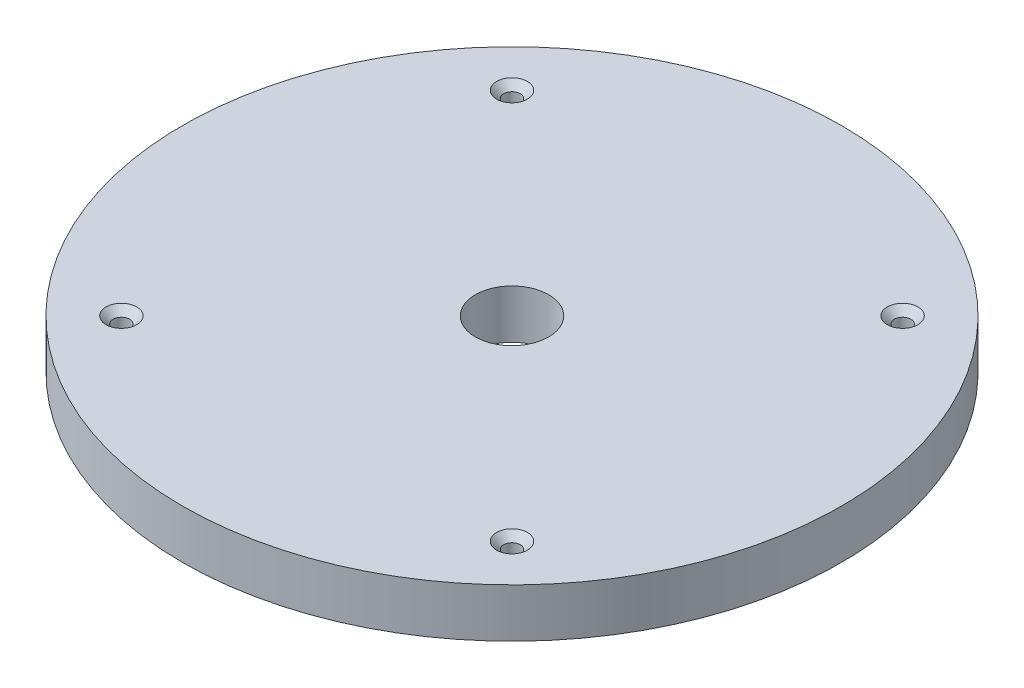
ISO-10303-21;
HEADER;
FILE_DESCRIPTION(('STEP AP214'),'2;1');
FILE_NAME('part.step','',(''),(''),'','','');
FILE_SCHEMA(('AUTOMOTIVE_DESIGN { 1 0 10303 214 1 1 1 1 }'));
ENDSEC;
DATA;
#1=APPLICATION_CONTEXT('core data for automotive mechanical design processes');
#2=APPLICATION_PROTOCOL_DEFINITION('international standard','automotive_design',2000,#1);
#3=PRODUCT_CONTEXT('',#1,'mechanical');
#4=PRODUCT('Part','Part','',(#3));
#5=PRODUCT_RELATED_PRODUCT_CATEGORY('part','',(#4));
#6=PRODUCT_DEFINITION_FORMATION('','',#4);
#7=PRODUCT_DEFINITION_CONTEXT('part definition',#1,'design');
#8=PRODUCT_DEFINITION('design','',#6,#7);
#9=PRODUCT_DEFINITION_SHAPE('','',#8);
#10=(LENGTH_UNIT() NAMED_UNIT(*) SI_UNIT(.MILLI.,.METRE.));
#11=(NAMED_UNIT(*) PLANE_ANGLE_UNIT() SI_UNIT($,.RADIAN.));
#12=(NAMED_UNIT(*) SI_UNIT($,.STERADIAN.) SOLID_ANGLE_UNIT());
#13=UNCERTAINTY_MEASURE_WITH_UNIT(LENGTH_MEASURE(1.E-05),#10,'distance_accuracy_value','');
#14=(GEOMETRIC_REPRESENTATION_CONTEXT(3) GLOBAL_UNCERTAINTY_ASSIGNED_CONTEXT((#13)) GLOBAL_UNIT_ASSIGNED_CONTEXT((#10,
#11,#12)) REPRESENTATION_CONTEXT('',''));
#15=CARTESIAN_POINT('',(0.,0.,0.));
#16=DIRECTION('',(0.,0.,1.));
#17=DIRECTION('',(1.,0.,0.));
#18=AXIS2_PLACEMENT_3D('',#15,#16,#17);
#19=CARTESIAN_POINT('',(0.,10.,0.));
#20=DIRECTION('',(0.,-1.,0.));
#21=DIRECTION('',(0.,0.,-1.));
#22=AXIS2_PLACEMENT_3D('',#19,#20,#21);
#23=CYLINDRICAL_SURFACE('',#22,67.5);
#24=CARTESIAN_POINT('',(0.,10.,0.));
#25=DIRECTION('',(0.,1.,0.));
#26=DIRECTION('',(0.,0.,1.));
#27=AXIS2_PLACEMENT_3D('',#24,#25,#26);
#28=CIRCLE('',#27,67.5);
#29=CARTESIAN_POINT('',(0.,10.,67.5));
#30=VERTEX_POINT('',#29);
#31=EDGE_CURVE('E10',#30,#30,#28,.T.);
#32=ORIENTED_EDGE('',*,*,#31,.F.);
#33=EDGE_LOOP('',(#32));
#34=FACE_BOUND('',#33,.T.);
#35=CARTESIAN_POINT('',(0.,0.,0.));
#36=DIRECTION('',(0.,1.,0.));
#37=DIRECTION('',(0.,0.,1.));
#38=AXIS2_PLACEMENT_3D('',#35,#36,#37);
#39=CIRCLE('',#38,67.5);
#40=CARTESIAN_POINT('',(0.,0.,67.5));
#41=VERTEX_POINT('',#40);
#42=EDGE_CURVE('E40',#41,#41,#39,.T.);
#43=ORIENTED_EDGE('',*,*,#42,.T.);
#44=EDGE_LOOP('',(#43));
#45=FACE_BOUND('',#44,.T.);
#46=ADVANCED_FACE('F37',(#34,#45),#23,.T.);
#47=CARTESIAN_POINT('',(0.,10.,0.));
#48=DIRECTION('',(0.,1.,0.));
#49=DIRECTION('',(0.,0.,1.));
#50=AXIS2_PLACEMENT_3D('',#47,#48,#49);
#51=PLANE('',#50);
#52=CARTESIAN_POINT('',(0.,10.,0.));
#53=DIRECTION('',(0.,1.,0.));
#54=DIRECTION('',(0.,0.,1.));
#55=AXIS2_PLACEMENT_3D('',#52,#53,#54);
#56=CIRCLE('',#55,7.5);
#57=CARTESIAN_POINT('',(0.,10.,7.5));
#58=VERTEX_POINT('',#57);
#59=EDGE_CURVE('E99',#58,#58,#56,.T.);
#60=ORIENTED_EDGE('',*,*,#59,.F.);
#61=EDGE_LOOP('',(#60));
#62=FACE_BOUND('',#61,.T.);
#63=CARTESIAN_POINT('',(-40.0000000000008,10.,-40.));
#64=DIRECTION('',(0.,1.,0.));
#65=DIRECTION('',(0.,0.,1.));
#66=AXIS2_PLACEMENT_3D('',#63,#64,#65);
#67=CIRCLE('',#66,3.15);
#68=CARTESIAN_POINT('',(-40.0000000000008,10.,-36.85));
#69=VERTEX_POINT('',#68);
#70=EDGE_CURVE('E94',#69,#69,#67,.T.);
#71=ORIENTED_EDGE('',*,*,#70,.F.);
#72=EDGE_LOOP('',(#71));
#73=FACE_BOUND('',#72,.T.);
#74=CARTESIAN_POINT('',(39.9999999999992,10.,-40.));
#75=DIRECTION('',(0.,1.,0.));
#76=DIRECTION('',(0.,0.,1.));
#77=AXIS2_PLACEMENT_3D('',#74,#75,#76);
#78=CIRCLE('',#77,3.15);
#79=CARTESIAN_POINT('',(39.9999999999992,10.,-36.85));
#80=VERTEX_POINT('',#79);
#81=EDGE_CURVE('E82',#80,#80,#78,.T.);
#82=ORIENTED_EDGE('',*,*,#81,.F.);
#83=EDGE_LOOP('',(#82));
#84=FACE_BOUND('',#83,.T.);
#85=CARTESIAN_POINT('',(40.,10.,40.));
#86=DIRECTION('',(0.,1.,0.));
#87=DIRECTION('',(0.,0.,1.));
#88=AXIS2_PLACEMENT_3D('',#85,#86,#87);
#89=CIRCLE('',#88,3.15);
#90=CARTESIAN_POINT('',(40.,10.,43.15));
#91=VERTEX_POINT('',#90);
#92=EDGE_CURVE('E70',#91,#91,#89,.T.);
#93=ORIENTED_EDGE('',*,*,#92,.F.);
#94=EDGE_LOOP('',(#93));
#95=FACE_BOUND('',#94,.T.);
#96=CARTESIAN_POINT('',(-40.,10.,40.));
#97=DIRECTION('',(0.,1.,0.));
#98=DIRECTION('',(0.,0.,1.));
#99=AXIS2_PLACEMENT_3D('',#96,#97,#98);
#100=CIRCLE('',#99,3.15);
#101=CARTESIAN_POINT('',(-40.,10.,43.15));
#102=VERTEX_POINT('',#101);
#103=EDGE_CURVE('E58',#102,#102,#100,.T.);
#104=ORIENTED_EDGE('',*,*,#103,.F.);
#105=EDGE_LOOP('',(#104));
#106=FACE_BOUND('',#105,.T.);
#107=ORIENTED_EDGE('',*,*,#31,.T.);
#108=EDGE_LOOP('',(#107));
#109=FACE_BOUND('',#108,.T.);
#110=ADVANCED_FACE('F117',(#62,#73,#84,#95,#106,#109),#51,.T.);
#111=CARTESIAN_POINT('',(0.,0.,0.));
#112=DIRECTION('',(0.,1.,0.));
#113=DIRECTION('',(0.,0.,1.));
#114=AXIS2_PLACEMENT_3D('',#111,#112,#113);
#115=PLANE('',#114);
#116=CARTESIAN_POINT('',(0.,0.,0.));
#117=DIRECTION('',(0.,1.,0.));
#118=DIRECTION('',(0.,0.,1.));
#119=AXIS2_PLACEMENT_3D('',#116,#117,#118);
#120=CIRCLE('',#119,7.5);
#121=CARTESIAN_POINT('',(0.,0.,7.5));
#122=VERTEX_POINT('',#121);
#123=EDGE_CURVE('E98',#122,#122,#120,.T.);
#124=ORIENTED_EDGE('',*,*,#123,.T.);
#125=EDGE_LOOP('',(#124));
#126=FACE_BOUND('',#125,.T.);
#127=CARTESIAN_POINT('',(-40.0000000000008,0.,-40.));
#128=DIRECTION('',(0.,1.,0.));
#129=DIRECTION('',(0.,0.,1.));
#130=AXIS2_PLACEMENT_3D('',#127,#128,#129);
#131=CIRCLE('',#130,1.7);
#132=CARTESIAN_POINT('',(-40.0000000000008,0.,-38.3));
#133=VERTEX_POINT('',#132);
#134=EDGE_CURVE('E86',#133,#133,#131,.T.);
#135=ORIENTED_EDGE('',*,*,#134,.T.);
#136=EDGE_LOOP('',(#135));
#137=FACE_BOUND('',#136,.T.);
#138=CARTESIAN_POINT('',(39.9999999999992,0.,-40.));
#139=DIRECTION('',(0.,1.,0.));
#140=DIRECTION('',(0.,0.,1.));
#141=AXIS2_PLACEMENT_3D('',#138,#139,#140);
#142=CIRCLE('',#141,1.7);
#143=CARTESIAN_POINT('',(39.9999999999992,0.,-38.3));
#144=VERTEX_POINT('',#143);
#145=EDGE_CURVE('E74',#144,#144,#142,.T.);
#146=ORIENTED_EDGE('',*,*,#145,.T.);
#147=EDGE_LOOP('',(#146));
#148=FACE_BOUND('',#147,.T.);
#149=CARTESIAN_POINT('',(40.,0.,40.));
#150=DIRECTION('',(0.,1.,0.));
#151=DIRECTION('',(0.,0.,1.));
#152=AXIS2_PLACEMENT_3D('',#149,#150,#151);
#153=CIRCLE('',#152,1.7);
#154=CARTESIAN_POINT('',(40.,0.,41.7));
#155=VERTEX_POINT('',#154);
#156=EDGE_CURVE('E62',#155,#155,#153,.T.);
#157=ORIENTED_EDGE('',*,*,#156,.T.);
#158=EDGE_LOOP('',(#157));
#159=FACE_BOUND('',#158,.T.);
#160=CARTESIAN_POINT('',(-40.,0.,40.));
#161=DIRECTION('',(0.,1.,0.));
#162=DIRECTION('',(0.,0.,1.));
#163=AXIS2_PLACEMENT_3D('',#160,#161,#162);
#164=CIRCLE('',#163,1.7);
#165=CARTESIAN_POINT('',(-40.,0.,41.7));
#166=VERTEX_POINT('',#165);
#167=EDGE_CURVE('E49',#166,#166,#164,.T.);
#168=ORIENTED_EDGE('',*,*,#167,.T.);
#169=EDGE_LOOP('',(#168));
#170=FACE_BOUND('',#169,.T.);
#171=ORIENTED_EDGE('',*,*,#42,.F.);
#172=EDGE_LOOP('',(#171));
#173=FACE_BOUND('',#172,.T.);
#174=ADVANCED_FACE('F107',(#126,#137,#148,#159,#170,#173),#115,.F.);
#175=CARTESIAN_POINT('',(-40.,10.,40.));
#176=DIRECTION('',(0.,1.,0.));
#177=DIRECTION('',(0.,0.,1.));
#178=AXIS2_PLACEMENT_3D('',#175,#176,#177);
#179=CYLINDRICAL_SURFACE('',#178,1.7);
#180=ORIENTED_EDGE('',*,*,#167,.F.);
#181=EDGE_LOOP('',(#180));
#182=FACE_BOUND('',#181,.T.);
#183=CARTESIAN_POINT('',(-40.,8.55,40.));
#184=DIRECTION('',(0.,1.,0.));
#185=DIRECTION('',(0.,0.,1.));
#186=AXIS2_PLACEMENT_3D('',#183,#184,#185);
#187=CIRCLE('',#186,1.7);
#188=CARTESIAN_POINT('',(-40.,8.55,41.7));
#189=VERTEX_POINT('',#188);
#190=EDGE_CURVE('E54',#189,#189,#187,.T.);
#191=ORIENTED_EDGE('',*,*,#190,.T.);
#192=EDGE_LOOP('',(#191));
#193=FACE_BOUND('',#192,.T.);
#194=ADVANCED_FACE('F132',(#182,#193),#179,.F.);
#195=CARTESIAN_POINT('',(-40.,10.,40.));
#196=DIRECTION('',(0.,1.,0.));
#197=DIRECTION('',(0.,0.,1.));
#198=AXIS2_PLACEMENT_3D('',#195,#196,#197);
#199=CONICAL_SURFACE('',#198,3.15,0.785398163397448);
#200=ORIENTED_EDGE('',*,*,#190,.F.);
#201=EDGE_LOOP('',(#200));
#202=FACE_BOUND('',#201,.T.);
#203=ORIENTED_EDGE('',*,*,#103,.T.);
#204=EDGE_LOOP('',(#203));
#205=FACE_BOUND('',#204,.T.);
#206=ADVANCED_FACE('F129',(#202,#205),#199,.F.);
#207=CARTESIAN_POINT('',(40.,10.,40.));
#208=DIRECTION('',(0.,1.,0.));
#209=DIRECTION('',(0.,0.,1.));
#210=AXIS2_PLACEMENT_3D('',#207,#208,#209);
#211=CYLINDRICAL_SURFACE('',#210,1.7);
#212=ORIENTED_EDGE('',*,*,#156,.F.);
#213=EDGE_LOOP('',(#212));
#214=FACE_BOUND('',#213,.T.);
#215=CARTESIAN_POINT('',(40.,8.55,40.));
#216=DIRECTION('',(0.,1.,0.));
#217=DIRECTION('',(0.,0.,1.));
#218=AXIS2_PLACEMENT_3D('',#215,#216,#217);
#219=CIRCLE('',#218,1.7);
#220=CARTESIAN_POINT('',(40.,8.55,41.7));
#221=VERTEX_POINT('',#220);
#222=EDGE_CURVE('E66',#221,#221,#219,.T.);
#223=ORIENTED_EDGE('',*,*,#222,.T.);
#224=EDGE_LOOP('',(#223));
#225=FACE_BOUND('',#224,.T.);
#226=ADVANCED_FACE('F131',(#214,#225),#211,.F.);
#227=CARTESIAN_POINT('',(40.,10.,40.));
#228=DIRECTION('',(0.,1.,0.));
#229=DIRECTION('',(0.,0.,1.));
#230=AXIS2_PLACEMENT_3D('',#227,#228,#229);
#231=CONICAL_SURFACE('',#230,3.15,0.785398163397448);
#232=ORIENTED_EDGE('',*,*,#222,.F.);
#233=EDGE_LOOP('',(#232));
#234=FACE_BOUND('',#233,.T.);
#235=ORIENTED_EDGE('',*,*,#92,.T.);
#236=EDGE_LOOP('',(#235));
#237=FACE_BOUND('',#236,.T.);
#238=ADVANCED_FACE('F139',(#234,#237),#231,.F.);
#239=CARTESIAN_POINT('',(39.9999999999992,10.,-40.));
#240=DIRECTION('',(0.,1.,0.));
#241=DIRECTION('',(0.,0.,1.));
#242=AXIS2_PLACEMENT_3D('',#239,#240,#241);
#243=CYLINDRICAL_SURFACE('',#242,1.7);
#244=ORIENTED_EDGE('',*,*,#145,.F.);
#245=EDGE_LOOP('',(#244));
#246=FACE_BOUND('',#245,.T.);
#247=CARTESIAN_POINT('',(39.9999999999992,8.55,-40.));
#248=DIRECTION('',(0.,1.,0.));
#249=DIRECTION('',(0.,0.,1.));
#250=AXIS2_PLACEMENT_3D('',#247,#248,#249);
#251=CIRCLE('',#250,1.7);
#252=CARTESIAN_POINT('',(39.9999999999992,8.55,-38.3));
#253=VERTEX_POINT('',#252);
#254=EDGE_CURVE('E78',#253,#253,#251,.T.);
#255=ORIENTED_EDGE('',*,*,#254,.T.);
#256=EDGE_LOOP('',(#255));
#257=FACE_BOUND('',#256,.T.);
#258=ADVANCED_FACE('F183',(#246,#257),#243,.F.);
#259=CARTESIAN_POINT('',(39.9999999999992,10.,-40.));
#260=DIRECTION('',(0.,1.,0.));
#261=DIRECTION('',(0.,0.,1.));
#262=AXIS2_PLACEMENT_3D('',#259,#260,#261);
#263=CONICAL_SURFACE('',#262,3.15,0.785398163397448);
#264=ORIENTED_EDGE('',*,*,#254,.F.);
#265=EDGE_LOOP('',(#264));
#266=FACE_BOUND('',#265,.T.);
#267=ORIENTED_EDGE('',*,*,#81,.T.);
#268=EDGE_LOOP('',(#267));
#269=FACE_BOUND('',#268,.T.);
#270=ADVANCED_FACE('F193',(#266,#269),#263,.F.);
#271=CARTESIAN_POINT('',(-40.0000000000008,10.,-40.));
#272=DIRECTION('',(0.,1.,0.));
#273=DIRECTION('',(0.,0.,1.));
#274=AXIS2_PLACEMENT_3D('',#271,#272,#273);
#275=CYLINDRICAL_SURFACE('',#274,1.7);
#276=ORIENTED_EDGE('',*,*,#134,.F.);
#277=EDGE_LOOP('',(#276));
#278=FACE_BOUND('',#277,.T.);
#279=CARTESIAN_POINT('',(-40.0000000000008,8.55,-40.));
#280=DIRECTION('',(0.,1.,0.));
#281=DIRECTION('',(0.,0.,1.));
#282=AXIS2_PLACEMENT_3D('',#279,#280,#281);
#283=CIRCLE('',#282,1.7);
#284=CARTESIAN_POINT('',(-40.0000000000008,8.55,-38.3));
#285=VERTEX_POINT('',#284);
#286=EDGE_CURVE('E90',#285,#285,#283,.T.);
#287=ORIENTED_EDGE('',*,*,#286,.T.);
#288=EDGE_LOOP('',(#287));
#289=FACE_BOUND('',#288,.T.);
#290=ADVANCED_FACE('F203',(#278,#289),#275,.F.);
#291=CARTESIAN_POINT('',(-40.0000000000008,10.,-40.));
#292=DIRECTION('',(0.,1.,0.));
#293=DIRECTION('',(0.,0.,1.));
#294=AXIS2_PLACEMENT_3D('',#291,#292,#293);
#295=CONICAL_SURFACE('',#294,3.15,0.785398163397448);
#296=ORIENTED_EDGE('',*,*,#286,.F.);
#297=EDGE_LOOP('',(#296));
#298=FACE_BOUND('',#297,.T.);
#299=ORIENTED_EDGE('',*,*,#70,.T.);
#300=EDGE_LOOP('',(#299));
#301=FACE_BOUND('',#300,.T.);
#302=ADVANCED_FACE('F113',(#298,#301),#295,.F.);
#303=CARTESIAN_POINT('',(0.,0.,0.));
#304=DIRECTION('',(0.,1.,0.));
#305=DIRECTION('',(0.,0.,1.));
#306=AXIS2_PLACEMENT_3D('',#303,#304,#305);
#307=CYLINDRICAL_SURFACE('',#306,7.5);
#308=ORIENTED_EDGE('',*,*,#123,.F.);
#309=EDGE_LOOP('',(#308));
#310=FACE_BOUND('',#309,.T.);
#311=ORIENTED_EDGE('',*,*,#59,.T.);
#312=EDGE_LOOP('',(#311));
#313=FACE_BOUND('',#312,.T.);
#314=ADVANCED_FACE('F110',(#310,#313),#307,.F.);
#315=CLOSED_SHELL('',(#46,#110,#174,#194,#206,#226,#238,#258,#270,#290,#302,#314));
#316=MANIFOLD_SOLID_BREP('B2',#315);
#317=ADVANCED_BREP_SHAPE_REPRESENTATION('',(#18,#316),#14);
#318=SHAPE_DEFINITION_REPRESENTATION(#9,#317);
ENDSEC;
END-ISO-10303-21;
